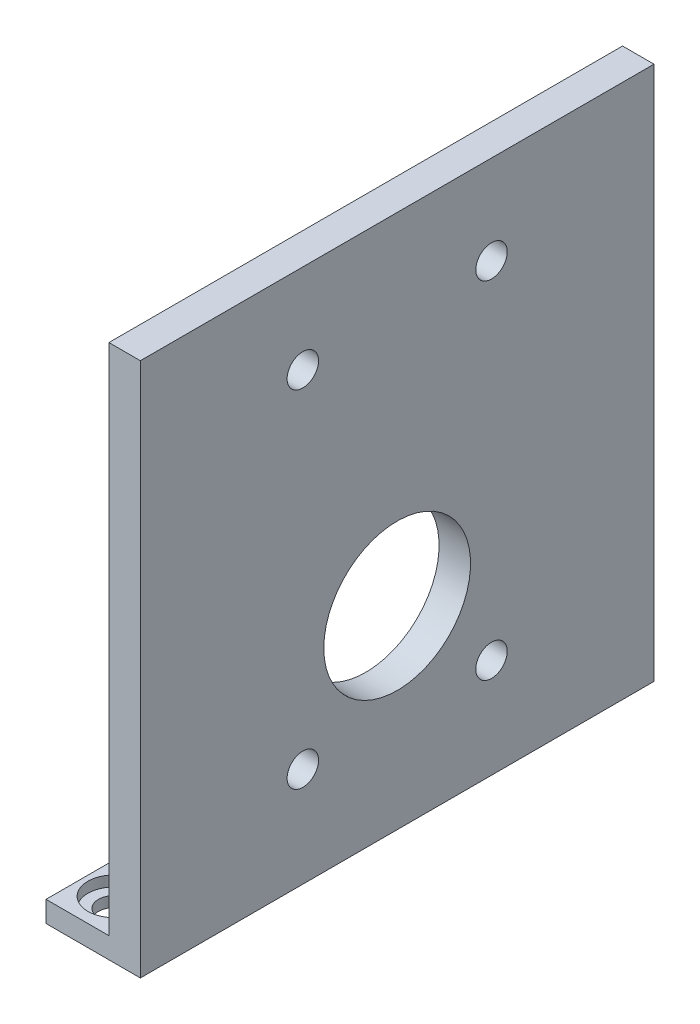
ISO-10303-21;
HEADER;
FILE_DESCRIPTION(('STEP AP214'),'2;1');
FILE_NAME('part.step','',(''),(''),'','','');
FILE_SCHEMA(('AUTOMOTIVE_DESIGN { 1 0 10303 214 1 1 1 1 }'));
ENDSEC;
DATA;
#1=APPLICATION_CONTEXT('core data for automotive mechanical design processes');
#2=APPLICATION_PROTOCOL_DEFINITION('international standard','automotive_design',2000,#1);
#3=PRODUCT_CONTEXT('',#1,'mechanical');
#4=PRODUCT('Part','Part','',(#3));
#5=PRODUCT_RELATED_PRODUCT_CATEGORY('part','',(#4));
#6=PRODUCT_DEFINITION_FORMATION('','',#4);
#7=PRODUCT_DEFINITION_CONTEXT('part definition',#1,'design');
#8=PRODUCT_DEFINITION('design','',#6,#7);
#9=PRODUCT_DEFINITION_SHAPE('','',#8);
#10=(LENGTH_UNIT() NAMED_UNIT(*) SI_UNIT(.MILLI.,.METRE.));
#11=(NAMED_UNIT(*) PLANE_ANGLE_UNIT() SI_UNIT($,.RADIAN.));
#12=(NAMED_UNIT(*) SI_UNIT($,.STERADIAN.) SOLID_ANGLE_UNIT());
#13=UNCERTAINTY_MEASURE_WITH_UNIT(LENGTH_MEASURE(1.E-05),#10,'distance_accuracy_value','');
#14=(GEOMETRIC_REPRESENTATION_CONTEXT(3) GLOBAL_UNCERTAINTY_ASSIGNED_CONTEXT((#13)) GLOBAL_UNIT_ASSIGNED_CONTEXT((#10,
#11,#12)) REPRESENTATION_CONTEXT('',''));
#15=CARTESIAN_POINT('',(0.,0.,0.));
#16=DIRECTION('',(0.,0.,1.));
#17=DIRECTION('',(1.,0.,0.));
#18=AXIS2_PLACEMENT_3D('',#15,#16,#17);
#19=CARTESIAN_POINT('',(4.5,2.,-24.5));
#20=DIRECTION('',(-1.,0.,0.));
#21=DIRECTION('',(0.,0.,1.));
#22=AXIS2_PLACEMENT_3D('',#19,#20,#21);
#23=PLANE('',#22);
#24=CARTESIAN_POINT('',(4.50000000000001,42.5,9.));
#25=DIRECTION('',(-1.,0.,0.));
#26=DIRECTION('',(0.,0.,1.));
#27=AXIS2_PLACEMENT_3D('',#24,#25,#26);
#28=CIRCLE('',#27,1.5);
#29=CARTESIAN_POINT('',(4.50000000000001,42.5,10.5));
#30=VERTEX_POINT('',#29);
#31=EDGE_CURVE('E158',#30,#30,#28,.T.);
#32=ORIENTED_EDGE('',*,*,#31,.T.);
#33=EDGE_LOOP('',(#32));
#34=FACE_BOUND('',#33,.T.);
#35=CARTESIAN_POINT('',(4.50000000000001,42.5,-8.99999999999999));
#36=DIRECTION('',(-1.,0.,0.));
#37=DIRECTION('',(0.,0.,1.));
#38=AXIS2_PLACEMENT_3D('',#35,#36,#37);
#39=CIRCLE('',#38,1.5);
#40=CARTESIAN_POINT('',(4.50000000000001,42.5,-7.49999999999999));
#41=VERTEX_POINT('',#40);
#42=EDGE_CURVE('E152',#41,#41,#39,.T.);
#43=ORIENTED_EDGE('',*,*,#42,.T.);
#44=EDGE_LOOP('',(#43));
#45=FACE_BOUND('',#44,.T.);
#46=CARTESIAN_POINT('',(4.50000000000001,9.5,9.));
#47=DIRECTION('',(-1.,0.,0.));
#48=DIRECTION('',(0.,0.,1.));
#49=AXIS2_PLACEMENT_3D('',#46,#47,#48);
#50=CIRCLE('',#49,1.5);
#51=CARTESIAN_POINT('',(4.50000000000001,9.5,10.5));
#52=VERTEX_POINT('',#51);
#53=EDGE_CURVE('E146',#52,#52,#50,.T.);
#54=ORIENTED_EDGE('',*,*,#53,.T.);
#55=EDGE_LOOP('',(#54));
#56=FACE_BOUND('',#55,.T.);
#57=CARTESIAN_POINT('',(4.50000000000001,9.5,-8.99999999999999));
#58=DIRECTION('',(-1.,0.,0.));
#59=DIRECTION('',(0.,0.,1.));
#60=AXIS2_PLACEMENT_3D('',#57,#58,#59);
#61=CIRCLE('',#60,1.5);
#62=CARTESIAN_POINT('',(4.50000000000001,9.5,-7.49999999999999));
#63=VERTEX_POINT('',#62);
#64=EDGE_CURVE('E139',#63,#63,#61,.T.);
#65=ORIENTED_EDGE('',*,*,#64,.T.);
#66=EDGE_LOOP('',(#65));
#67=FACE_BOUND('',#66,.T.);
#68=CARTESIAN_POINT('',(4.50000000000001,18.5,0.));
#69=DIRECTION('',(-1.,0.,0.));
#70=DIRECTION('',(0.,0.,1.));
#71=AXIS2_PLACEMENT_3D('',#68,#69,#70);
#72=CIRCLE('',#71,7.);
#73=CARTESIAN_POINT('',(4.50000000000001,18.5,7.));
#74=VERTEX_POINT('',#73);
#75=EDGE_CURVE('E163',#74,#74,#72,.T.);
#76=ORIENTED_EDGE('',*,*,#75,.T.);
#77=EDGE_LOOP('',(#76));
#78=FACE_BOUND('',#77,.T.);
#79=DIRECTION('',(0.,0.,-1.));
#80=VECTOR('',#79,1.);
#81=CARTESIAN_POINT('',(4.5,0.,-24.5));
#82=LINE('',#81,#80);
#83=CARTESIAN_POINT('',(4.5,0.,24.5));
#84=VERTEX_POINT('',#83);
#85=CARTESIAN_POINT('',(4.5,0.,-24.5));
#86=VERTEX_POINT('',#85);
#87=EDGE_CURVE('E94',#84,#86,#82,.T.);
#88=ORIENTED_EDGE('',*,*,#87,.T.);
#89=DIRECTION('',(0.,-1.,0.));
#90=VECTOR('',#89,1.);
#91=CARTESIAN_POINT('',(4.5,2.,-24.5));
#92=LINE('',#91,#90);
#93=CARTESIAN_POINT('',(4.5,51.,-24.5));
#94=VERTEX_POINT('',#93);
#95=EDGE_CURVE('E11',#94,#86,#92,.T.);
#96=ORIENTED_EDGE('',*,*,#95,.F.);
#97=DIRECTION('',(0.,0.,-1.));
#98=VECTOR('',#97,1.);
#99=CARTESIAN_POINT('',(4.5,51.,-24.5));
#100=LINE('',#99,#98);
#101=CARTESIAN_POINT('',(4.5,51.,24.5));
#102=VERTEX_POINT('',#101);
#103=EDGE_CURVE('E96',#102,#94,#100,.T.);
#104=ORIENTED_EDGE('',*,*,#103,.F.);
#105=DIRECTION('',(0.,-1.,0.));
#106=VECTOR('',#105,1.);
#107=CARTESIAN_POINT('',(4.5,2.,24.5));
#108=LINE('',#107,#106);
#109=EDGE_CURVE('E80',#102,#84,#108,.T.);
#110=ORIENTED_EDGE('',*,*,#109,.T.);
#111=EDGE_LOOP('',(#88,#96,#104,#110));
#112=FACE_BOUND('',#111,.T.);
#113=ADVANCED_FACE('F33',(#34,#45,#56,#67,#78,#112),#23,.F.);
#114=CARTESIAN_POINT('',(-4.5,2.,-24.5));
#115=DIRECTION('',(0.,0.,1.));
#116=DIRECTION('',(1.,0.,0.));
#117=AXIS2_PLACEMENT_3D('',#114,#115,#116);
#118=PLANE('',#117);
#119=DIRECTION('',(-1.,0.,0.));
#120=VECTOR('',#119,1.);
#121=CARTESIAN_POINT('',(-4.5,0.,-24.5));
#122=LINE('',#121,#120);
#123=CARTESIAN_POINT('',(-4.5,0.,-24.5));
#124=VERTEX_POINT('',#123);
#125=EDGE_CURVE('E100',#86,#124,#122,.T.);
#126=ORIENTED_EDGE('',*,*,#125,.T.);
#127=DIRECTION('',(0.,-1.,0.));
#128=VECTOR('',#127,1.);
#129=CARTESIAN_POINT('',(-4.5,2.,-24.5));
#130=LINE('',#129,#128);
#131=CARTESIAN_POINT('',(-4.5,2.,-24.5));
#132=VERTEX_POINT('',#131);
#133=EDGE_CURVE('E41',#132,#124,#130,.T.);
#134=ORIENTED_EDGE('',*,*,#133,.F.);
#135=DIRECTION('',(-1.,0.,0.));
#136=VECTOR('',#135,1.);
#137=CARTESIAN_POINT('',(-4.5,2.,-24.5));
#138=LINE('',#137,#136);
#139=CARTESIAN_POINT('',(1.50000000000001,2.,-24.5));
#140=VERTEX_POINT('',#139);
#141=EDGE_CURVE('E87',#140,#132,#138,.T.);
#142=ORIENTED_EDGE('',*,*,#141,.F.);
#143=DIRECTION('',(0.,-1.,0.));
#144=VECTOR('',#143,1.);
#145=CARTESIAN_POINT('',(1.5,51.,-24.5));
#146=LINE('',#145,#144);
#147=CARTESIAN_POINT('',(1.5,51.,-24.5));
#148=VERTEX_POINT('',#147);
#149=EDGE_CURVE('E105',#148,#140,#146,.T.);
#150=ORIENTED_EDGE('',*,*,#149,.F.);
#151=DIRECTION('',(-1.,0.,0.));
#152=VECTOR('',#151,1.);
#153=CARTESIAN_POINT('',(4.5,51.,-24.5));
#154=LINE('',#153,#152);
#155=EDGE_CURVE('E174',#94,#148,#154,.T.);
#156=ORIENTED_EDGE('',*,*,#155,.F.);
#157=ORIENTED_EDGE('',*,*,#95,.T.);
#158=EDGE_LOOP('',(#126,#134,#142,#150,#156,#157));
#159=FACE_BOUND('',#158,.T.);
#160=ADVANCED_FACE('F190',(#159),#118,.F.);
#161=CARTESIAN_POINT('',(-4.5,2.,-24.5));
#162=DIRECTION('',(1.,0.,0.));
#163=DIRECTION('',(0.,0.,-1.));
#164=AXIS2_PLACEMENT_3D('',#161,#162,#163);
#165=PLANE('',#164);
#166=DIRECTION('',(0.,0.,1.));
#167=VECTOR('',#166,1.);
#168=CARTESIAN_POINT('',(-4.5,0.,-24.5));
#169=LINE('',#168,#167);
#170=CARTESIAN_POINT('',(-4.5,0.,24.5));
#171=VERTEX_POINT('',#170);
#172=EDGE_CURVE('E88',#124,#171,#169,.T.);
#173=ORIENTED_EDGE('',*,*,#172,.T.);
#174=DIRECTION('',(0.,-1.,0.));
#175=VECTOR('',#174,1.);
#176=CARTESIAN_POINT('',(-4.5,2.,24.5));
#177=LINE('',#176,#175);
#178=CARTESIAN_POINT('',(-4.5,2.,24.5));
#179=VERTEX_POINT('',#178);
#180=EDGE_CURVE('E83',#179,#171,#177,.T.);
#181=ORIENTED_EDGE('',*,*,#180,.F.);
#182=DIRECTION('',(0.,0.,1.));
#183=VECTOR('',#182,1.);
#184=CARTESIAN_POINT('',(-4.5,2.,-24.5));
#185=LINE('',#184,#183);
#186=EDGE_CURVE('E55',#132,#179,#185,.T.);
#187=ORIENTED_EDGE('',*,*,#186,.F.);
#188=ORIENTED_EDGE('',*,*,#133,.T.);
#189=EDGE_LOOP('',(#173,#181,#187,#188));
#190=FACE_BOUND('',#189,.T.);
#191=ADVANCED_FACE('F216',(#190),#165,.F.);
#192=CARTESIAN_POINT('',(-4.5,2.,24.5));
#193=DIRECTION('',(0.,0.,-1.));
#194=DIRECTION('',(-1.,0.,0.));
#195=AXIS2_PLACEMENT_3D('',#192,#193,#194);
#196=PLANE('',#195);
#197=DIRECTION('',(1.,0.,0.));
#198=VECTOR('',#197,1.);
#199=CARTESIAN_POINT('',(-4.5,0.,24.5));
#200=LINE('',#199,#198);
#201=EDGE_CURVE('E75',#171,#84,#200,.T.);
#202=ORIENTED_EDGE('',*,*,#201,.T.);
#203=ORIENTED_EDGE('',*,*,#109,.F.);
#204=DIRECTION('',(1.,0.,0.));
#205=VECTOR('',#204,1.);
#206=CARTESIAN_POINT('',(4.5,51.,24.5));
#207=LINE('',#206,#205);
#208=CARTESIAN_POINT('',(1.50000000000001,51.,24.5));
#209=VERTEX_POINT('',#208);
#210=EDGE_CURVE('E171',#209,#102,#207,.T.);
#211=ORIENTED_EDGE('',*,*,#210,.F.);
#212=DIRECTION('',(0.,-1.,0.));
#213=VECTOR('',#212,1.);
#214=CARTESIAN_POINT('',(1.50000000000001,51.,24.5));
#215=LINE('',#214,#213);
#216=CARTESIAN_POINT('',(1.50000000000001,2.,24.5));
#217=VERTEX_POINT('',#216);
#218=EDGE_CURVE('E101',#209,#217,#215,.T.);
#219=ORIENTED_EDGE('',*,*,#218,.T.);
#220=DIRECTION('',(1.,0.,0.));
#221=VECTOR('',#220,1.);
#222=CARTESIAN_POINT('',(-4.5,2.,24.5));
#223=LINE('',#222,#221);
#224=EDGE_CURVE('E97',#179,#217,#223,.T.);
#225=ORIENTED_EDGE('',*,*,#224,.F.);
#226=ORIENTED_EDGE('',*,*,#180,.T.);
#227=EDGE_LOOP('',(#202,#203,#211,#219,#225,#226));
#228=FACE_BOUND('',#227,.T.);
#229=ADVANCED_FACE('F77',(#228),#196,.F.);
#230=CARTESIAN_POINT('',(0.,2.,0.));
#231=DIRECTION('',(0.,1.,0.));
#232=DIRECTION('',(0.,0.,1.));
#233=AXIS2_PLACEMENT_3D('',#230,#231,#232);
#234=PLANE('',#233);
#235=CARTESIAN_POINT('',(-1.5,2.,-21.));
#236=DIRECTION('',(0.,1.,0.));
#237=DIRECTION('',(0.,0.,1.));
#238=AXIS2_PLACEMENT_3D('',#235,#236,#237);
#239=CIRCLE('',#238,2.5);
#240=CARTESIAN_POINT('',(-1.5,2.,-18.5));
#241=VERTEX_POINT('',#240);
#242=EDGE_CURVE('E134',#241,#241,#239,.T.);
#243=ORIENTED_EDGE('',*,*,#242,.F.);
#244=EDGE_LOOP('',(#243));
#245=FACE_BOUND('',#244,.T.);
#246=CARTESIAN_POINT('',(-1.49999999999999,2.,21.));
#247=DIRECTION('',(0.,1.,0.));
#248=DIRECTION('',(0.,0.,1.));
#249=AXIS2_PLACEMENT_3D('',#246,#247,#248);
#250=CIRCLE('',#249,2.5);
#251=CARTESIAN_POINT('',(-1.49999999999999,2.,23.5));
#252=VERTEX_POINT('',#251);
#253=EDGE_CURVE('E115',#252,#252,#250,.T.);
#254=ORIENTED_EDGE('',*,*,#253,.F.);
#255=EDGE_LOOP('',(#254));
#256=FACE_BOUND('',#255,.T.);
#257=DIRECTION('',(0.,0.,1.));
#258=VECTOR('',#257,1.);
#259=CARTESIAN_POINT('',(1.5,2.,-24.5));
#260=LINE('',#259,#258);
#261=EDGE_CURVE('E49',#140,#217,#260,.T.);
#262=ORIENTED_EDGE('',*,*,#261,.F.);
#263=ORIENTED_EDGE('',*,*,#141,.T.);
#264=ORIENTED_EDGE('',*,*,#186,.T.);
#265=ORIENTED_EDGE('',*,*,#224,.T.);
#266=EDGE_LOOP('',(#262,#263,#264,#265));
#267=FACE_BOUND('',#266,.T.);
#268=ADVANCED_FACE('F181',(#245,#256,#267),#234,.T.);
#269=CARTESIAN_POINT('',(0.,0.,0.));
#270=DIRECTION('',(0.,1.,0.));
#271=DIRECTION('',(0.,0.,1.));
#272=AXIS2_PLACEMENT_3D('',#269,#270,#271);
#273=PLANE('',#272);
#274=CARTESIAN_POINT('',(-1.49999999999999,0.,21.));
#275=DIRECTION('',(0.,1.,0.));
#276=DIRECTION('',(0.,0.,1.));
#277=AXIS2_PLACEMENT_3D('',#274,#275,#276);
#278=CIRCLE('',#277,1.5);
#279=CARTESIAN_POINT('',(-1.49999999999999,0.,22.5));
#280=VERTEX_POINT('',#279);
#281=EDGE_CURVE('E36',#280,#280,#278,.T.);
#282=ORIENTED_EDGE('',*,*,#281,.T.);
#283=EDGE_LOOP('',(#282));
#284=FACE_BOUND('',#283,.T.);
#285=CARTESIAN_POINT('',(-1.5,0.,-21.));
#286=DIRECTION('',(0.,1.,0.));
#287=DIRECTION('',(0.,0.,1.));
#288=AXIS2_PLACEMENT_3D('',#285,#286,#287);
#289=CIRCLE('',#288,1.5);
#290=CARTESIAN_POINT('',(-1.5,0.,-19.5));
#291=VERTEX_POINT('',#290);
#292=EDGE_CURVE('E113',#291,#291,#289,.T.);
#293=ORIENTED_EDGE('',*,*,#292,.T.);
#294=EDGE_LOOP('',(#293));
#295=FACE_BOUND('',#294,.T.);
#296=ORIENTED_EDGE('',*,*,#87,.F.);
#297=ORIENTED_EDGE('',*,*,#201,.F.);
#298=ORIENTED_EDGE('',*,*,#172,.F.);
#299=ORIENTED_EDGE('',*,*,#125,.F.);
#300=EDGE_LOOP('',(#296,#297,#298,#299));
#301=FACE_BOUND('',#300,.T.);
#302=ADVANCED_FACE('F99',(#284,#295,#301),#273,.F.);
#303=CARTESIAN_POINT('',(1.5,51.,-24.5));
#304=DIRECTION('',(1.,0.,0.));
#305=DIRECTION('',(0.,0.,-1.));
#306=AXIS2_PLACEMENT_3D('',#303,#304,#305);
#307=PLANE('',#306);
#308=CARTESIAN_POINT('',(1.50000000000001,42.5,9.));
#309=DIRECTION('',(-1.,0.,0.));
#310=DIRECTION('',(0.,0.,1.));
#311=AXIS2_PLACEMENT_3D('',#308,#309,#310);
#312=CIRCLE('',#311,1.5);
#313=CARTESIAN_POINT('',(1.50000000000001,42.5,10.5));
#314=VERTEX_POINT('',#313);
#315=EDGE_CURVE('E133',#314,#314,#312,.T.);
#316=ORIENTED_EDGE('',*,*,#315,.F.);
#317=EDGE_LOOP('',(#316));
#318=FACE_BOUND('',#317,.T.);
#319=CARTESIAN_POINT('',(1.50000000000001,42.5,-8.99999999999999));
#320=DIRECTION('',(-1.,0.,0.));
#321=DIRECTION('',(0.,0.,1.));
#322=AXIS2_PLACEMENT_3D('',#319,#320,#321);
#323=CIRCLE('',#322,1.5);
#324=CARTESIAN_POINT('',(1.50000000000001,42.5,-7.49999999999999));
#325=VERTEX_POINT('',#324);
#326=EDGE_CURVE('E155',#325,#325,#323,.T.);
#327=ORIENTED_EDGE('',*,*,#326,.F.);
#328=EDGE_LOOP('',(#327));
#329=FACE_BOUND('',#328,.T.);
#330=CARTESIAN_POINT('',(1.50000000000001,9.5,9.));
#331=DIRECTION('',(-1.,0.,0.));
#332=DIRECTION('',(0.,0.,1.));
#333=AXIS2_PLACEMENT_3D('',#330,#331,#332);
#334=CIRCLE('',#333,1.5);
#335=CARTESIAN_POINT('',(1.50000000000001,9.5,10.5));
#336=VERTEX_POINT('',#335);
#337=EDGE_CURVE('E149',#336,#336,#334,.T.);
#338=ORIENTED_EDGE('',*,*,#337,.F.);
#339=EDGE_LOOP('',(#338));
#340=FACE_BOUND('',#339,.T.);
#341=CARTESIAN_POINT('',(1.50000000000001,9.5,-8.99999999999999));
#342=DIRECTION('',(-1.,0.,0.));
#343=DIRECTION('',(0.,0.,1.));
#344=AXIS2_PLACEMENT_3D('',#341,#342,#343);
#345=CIRCLE('',#344,1.5);
#346=CARTESIAN_POINT('',(1.50000000000001,9.5,-7.49999999999999));
#347=VERTEX_POINT('',#346);
#348=EDGE_CURVE('E143',#347,#347,#345,.T.);
#349=ORIENTED_EDGE('',*,*,#348,.F.);
#350=EDGE_LOOP('',(#349));
#351=FACE_BOUND('',#350,.T.);
#352=CARTESIAN_POINT('',(1.50000000000001,18.5,0.));
#353=DIRECTION('',(-1.,0.,0.));
#354=DIRECTION('',(0.,0.,1.));
#355=AXIS2_PLACEMENT_3D('',#352,#353,#354);
#356=CIRCLE('',#355,7.);
#357=CARTESIAN_POINT('',(1.50000000000001,18.5,7.));
#358=VERTEX_POINT('',#357);
#359=EDGE_CURVE('E142',#358,#358,#356,.T.);
#360=ORIENTED_EDGE('',*,*,#359,.F.);
#361=EDGE_LOOP('',(#360));
#362=FACE_BOUND('',#361,.T.);
#363=ORIENTED_EDGE('',*,*,#261,.T.);
#364=ORIENTED_EDGE('',*,*,#218,.F.);
#365=DIRECTION('',(0.,0.,1.));
#366=VECTOR('',#365,1.);
#367=CARTESIAN_POINT('',(1.5,51.,-24.5));
#368=LINE('',#367,#366);
#369=EDGE_CURVE('E168',#148,#209,#368,.T.);
#370=ORIENTED_EDGE('',*,*,#369,.F.);
#371=ORIENTED_EDGE('',*,*,#149,.T.);
#372=EDGE_LOOP('',(#363,#364,#370,#371));
#373=FACE_BOUND('',#372,.T.);
#374=ADVANCED_FACE('F186',(#318,#329,#340,#351,#362,#373),#307,.F.);
#375=CARTESIAN_POINT('',(0.,51.,0.));
#376=DIRECTION('',(0.,-1.,0.));
#377=DIRECTION('',(0.,0.,-1.));
#378=AXIS2_PLACEMENT_3D('',#375,#376,#377);
#379=PLANE('',#378);
#380=ORIENTED_EDGE('',*,*,#369,.T.);
#381=ORIENTED_EDGE('',*,*,#210,.T.);
#382=ORIENTED_EDGE('',*,*,#103,.T.);
#383=ORIENTED_EDGE('',*,*,#155,.T.);
#384=EDGE_LOOP('',(#380,#381,#382,#383));
#385=FACE_BOUND('',#384,.T.);
#386=ADVANCED_FACE('F198',(#385),#379,.F.);
#387=CARTESIAN_POINT('',(4.50000000000001,18.5,0.));
#388=DIRECTION('',(-1.,0.,0.));
#389=DIRECTION('',(0.,0.,1.));
#390=AXIS2_PLACEMENT_3D('',#387,#388,#389);
#391=CYLINDRICAL_SURFACE('',#390,7.);
#392=ORIENTED_EDGE('',*,*,#75,.F.);
#393=EDGE_LOOP('',(#392));
#394=FACE_BOUND('',#393,.T.);
#395=ORIENTED_EDGE('',*,*,#359,.T.);
#396=EDGE_LOOP('',(#395));
#397=FACE_BOUND('',#396,.T.);
#398=ADVANCED_FACE('F200',(#394,#397),#391,.F.);
#399=CARTESIAN_POINT('',(4.50000000000001,9.5,-8.99999999999999));
#400=DIRECTION('',(-1.,0.,0.));
#401=DIRECTION('',(0.,0.,1.));
#402=AXIS2_PLACEMENT_3D('',#399,#400,#401);
#403=CYLINDRICAL_SURFACE('',#402,1.5);
#404=ORIENTED_EDGE('',*,*,#64,.F.);
#405=EDGE_LOOP('',(#404));
#406=FACE_BOUND('',#405,.T.);
#407=ORIENTED_EDGE('',*,*,#348,.T.);
#408=EDGE_LOOP('',(#407));
#409=FACE_BOUND('',#408,.T.);
#410=ADVANCED_FACE('F206',(#406,#409),#403,.F.);
#411=CARTESIAN_POINT('',(4.50000000000001,9.5,9.));
#412=DIRECTION('',(-1.,0.,0.));
#413=DIRECTION('',(0.,0.,1.));
#414=AXIS2_PLACEMENT_3D('',#411,#412,#413);
#415=CYLINDRICAL_SURFACE('',#414,1.5);
#416=ORIENTED_EDGE('',*,*,#53,.F.);
#417=EDGE_LOOP('',(#416));
#418=FACE_BOUND('',#417,.T.);
#419=ORIENTED_EDGE('',*,*,#337,.T.);
#420=EDGE_LOOP('',(#419));
#421=FACE_BOUND('',#420,.T.);
#422=ADVANCED_FACE('F232',(#418,#421),#415,.F.);
#423=CARTESIAN_POINT('',(4.50000000000001,42.5,-8.99999999999999));
#424=DIRECTION('',(-1.,0.,0.));
#425=DIRECTION('',(0.,0.,1.));
#426=AXIS2_PLACEMENT_3D('',#423,#424,#425);
#427=CYLINDRICAL_SURFACE('',#426,1.5);
#428=ORIENTED_EDGE('',*,*,#42,.F.);
#429=EDGE_LOOP('',(#428));
#430=FACE_BOUND('',#429,.T.);
#431=ORIENTED_EDGE('',*,*,#326,.T.);
#432=EDGE_LOOP('',(#431));
#433=FACE_BOUND('',#432,.T.);
#434=ADVANCED_FACE('F239',(#430,#433),#427,.F.);
#435=CARTESIAN_POINT('',(4.50000000000001,42.5,9.));
#436=DIRECTION('',(-1.,0.,0.));
#437=DIRECTION('',(0.,0.,1.));
#438=AXIS2_PLACEMENT_3D('',#435,#436,#437);
#439=CYLINDRICAL_SURFACE('',#438,1.5);
#440=ORIENTED_EDGE('',*,*,#31,.F.);
#441=EDGE_LOOP('',(#440));
#442=FACE_BOUND('',#441,.T.);
#443=ORIENTED_EDGE('',*,*,#315,.T.);
#444=EDGE_LOOP('',(#443));
#445=FACE_BOUND('',#444,.T.);
#446=ADVANCED_FACE('F248',(#442,#445),#439,.F.);
#447=CARTESIAN_POINT('',(-1.49999999999999,1.,21.));
#448=DIRECTION('',(0.,1.,0.));
#449=DIRECTION('',(0.,0.,1.));
#450=AXIS2_PLACEMENT_3D('',#447,#448,#449);
#451=CYLINDRICAL_SURFACE('',#450,2.5);
#452=CARTESIAN_POINT('',(-1.49999999999999,1.,21.));
#453=DIRECTION('',(0.,1.,0.));
#454=DIRECTION('',(0.,0.,1.));
#455=AXIS2_PLACEMENT_3D('',#452,#453,#454);
#456=CIRCLE('',#455,2.5);
#457=CARTESIAN_POINT('',(-1.49999999999999,1.,23.5));
#458=VERTEX_POINT('',#457);
#459=EDGE_CURVE('E120',#458,#458,#456,.T.);
#460=ORIENTED_EDGE('',*,*,#459,.F.);
#461=EDGE_LOOP('',(#460));
#462=FACE_BOUND('',#461,.T.);
#463=ORIENTED_EDGE('',*,*,#253,.T.);
#464=EDGE_LOOP('',(#463));
#465=FACE_BOUND('',#464,.T.);
#466=ADVANCED_FACE('F243',(#462,#465),#451,.F.);
#467=CARTESIAN_POINT('',(-1.49999999999999,1.,21.));
#468=DIRECTION('',(0.,1.,0.));
#469=DIRECTION('',(0.,0.,1.));
#470=AXIS2_PLACEMENT_3D('',#467,#468,#469);
#471=PLANE('',#470);
#472=CARTESIAN_POINT('',(-1.49999999999999,1.,21.));
#473=DIRECTION('',(0.,1.,0.));
#474=DIRECTION('',(0.,0.,1.));
#475=AXIS2_PLACEMENT_3D('',#472,#473,#474);
#476=CIRCLE('',#475,1.5);
#477=CARTESIAN_POINT('',(-1.49999999999999,1.,22.5));
#478=VERTEX_POINT('',#477);
#479=EDGE_CURVE('E127',#478,#478,#476,.T.);
#480=ORIENTED_EDGE('',*,*,#479,.F.);
#481=EDGE_LOOP('',(#480));
#482=FACE_BOUND('',#481,.T.);
#483=ORIENTED_EDGE('',*,*,#459,.T.);
#484=EDGE_LOOP('',(#483));
#485=FACE_BOUND('',#484,.T.);
#486=ADVANCED_FACE('F255',(#482,#485),#471,.T.);
#487=CARTESIAN_POINT('',(-1.5,1.,-21.));
#488=DIRECTION('',(0.,1.,0.));
#489=DIRECTION('',(0.,0.,1.));
#490=AXIS2_PLACEMENT_3D('',#487,#488,#489);
#491=CYLINDRICAL_SURFACE('',#490,2.5);
#492=CARTESIAN_POINT('',(-1.5,1.,-21.));
#493=DIRECTION('',(0.,1.,0.));
#494=DIRECTION('',(0.,0.,1.));
#495=AXIS2_PLACEMENT_3D('',#492,#493,#494);
#496=CIRCLE('',#495,2.5);
#497=CARTESIAN_POINT('',(-1.5,1.,-18.5));
#498=VERTEX_POINT('',#497);
#499=EDGE_CURVE('E130',#498,#498,#496,.T.);
#500=ORIENTED_EDGE('',*,*,#499,.F.);
#501=EDGE_LOOP('',(#500));
#502=FACE_BOUND('',#501,.T.);
#503=ORIENTED_EDGE('',*,*,#242,.T.);
#504=EDGE_LOOP('',(#503));
#505=FACE_BOUND('',#504,.T.);
#506=ADVANCED_FACE('F268',(#502,#505),#491,.F.);
#507=CARTESIAN_POINT('',(-1.5,1.,-21.));
#508=DIRECTION('',(0.,1.,0.));
#509=DIRECTION('',(0.,0.,1.));
#510=AXIS2_PLACEMENT_3D('',#507,#508,#509);
#511=PLANE('',#510);
#512=CARTESIAN_POINT('',(-1.5,1.,-21.));
#513=DIRECTION('',(0.,1.,0.));
#514=DIRECTION('',(0.,0.,1.));
#515=AXIS2_PLACEMENT_3D('',#512,#513,#514);
#516=CIRCLE('',#515,1.5);
#517=CARTESIAN_POINT('',(-1.5,1.,-19.5));
#518=VERTEX_POINT('',#517);
#519=EDGE_CURVE('E116',#518,#518,#516,.T.);
#520=ORIENTED_EDGE('',*,*,#519,.F.);
#521=EDGE_LOOP('',(#520));
#522=FACE_BOUND('',#521,.T.);
#523=ORIENTED_EDGE('',*,*,#499,.T.);
#524=EDGE_LOOP('',(#523));
#525=FACE_BOUND('',#524,.T.);
#526=ADVANCED_FACE('F359',(#522,#525),#511,.T.);
#527=CARTESIAN_POINT('',(-1.5,-1.,-21.));
#528=DIRECTION('',(0.,1.,0.));
#529=DIRECTION('',(0.,0.,1.));
#530=AXIS2_PLACEMENT_3D('',#527,#528,#529);
#531=CYLINDRICAL_SURFACE('',#530,1.5);
#532=ORIENTED_EDGE('',*,*,#519,.T.);
#533=EDGE_LOOP('',(#532));
#534=FACE_BOUND('',#533,.T.);
#535=ORIENTED_EDGE('',*,*,#292,.F.);
#536=EDGE_LOOP('',(#535));
#537=FACE_BOUND('',#536,.T.);
#538=ADVANCED_FACE('F369',(#534,#537),#531,.F.);
#539=CARTESIAN_POINT('',(-1.49999999999999,-1.,21.));
#540=DIRECTION('',(0.,1.,0.));
#541=DIRECTION('',(0.,0.,1.));
#542=AXIS2_PLACEMENT_3D('',#539,#540,#541);
#543=CYLINDRICAL_SURFACE('',#542,1.5);
#544=ORIENTED_EDGE('',*,*,#479,.T.);
#545=EDGE_LOOP('',(#544));
#546=FACE_BOUND('',#545,.T.);
#547=ORIENTED_EDGE('',*,*,#281,.F.);
#548=EDGE_LOOP('',(#547));
#549=FACE_BOUND('',#548,.T.);
#550=ADVANCED_FACE('F379',(#546,#549),#543,.F.);
#551=CLOSED_SHELL('',(#113,#160,#191,#229,#268,#302,#374,#386,#398,#410,#422,#434,#446,#466,
#486,#506,#526,#538,#550));
#552=MANIFOLD_SOLID_BREP('B2',#551);
#553=ADVANCED_BREP_SHAPE_REPRESENTATION('',(#18,#552),#14);
#554=SHAPE_DEFINITION_REPRESENTATION(#9,#553);
ENDSEC;
END-ISO-10303-21;
